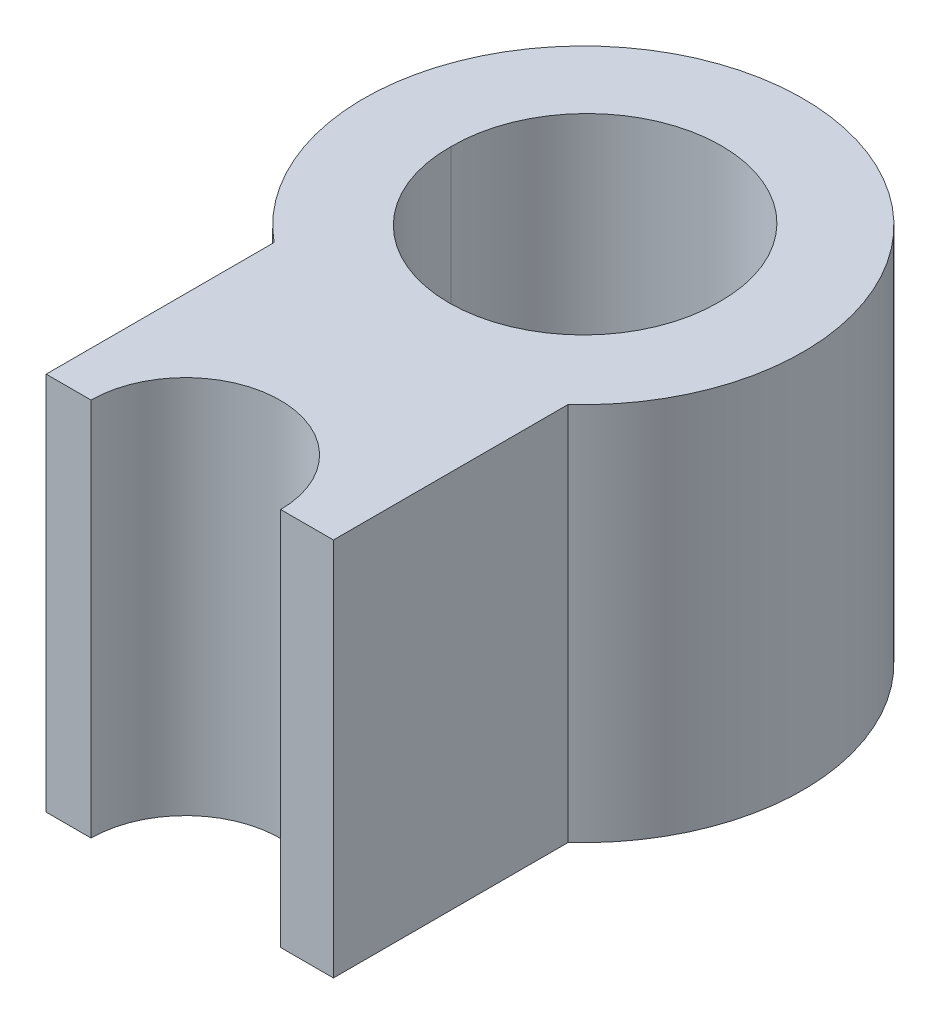
ISO-10303-21;
HEADER;
FILE_DESCRIPTION(('STEP AP214'),'2;1');
FILE_NAME('part.step','',(''),(''),'','','');
FILE_SCHEMA(('AUTOMOTIVE_DESIGN { 1 0 10303 214 1 1 1 1 }'));
ENDSEC;
DATA;
#1=APPLICATION_CONTEXT('core data for automotive mechanical design processes');
#2=APPLICATION_PROTOCOL_DEFINITION('international standard','automotive_design',2000,#1);
#3=PRODUCT_CONTEXT('',#1,'mechanical');
#4=PRODUCT('Part','Part','',(#3));
#5=PRODUCT_RELATED_PRODUCT_CATEGORY('part','',(#4));
#6=PRODUCT_DEFINITION_FORMATION('','',#4);
#7=PRODUCT_DEFINITION_CONTEXT('part definition',#1,'design');
#8=PRODUCT_DEFINITION('design','',#6,#7);
#9=PRODUCT_DEFINITION_SHAPE('','',#8);
#10=(LENGTH_UNIT() NAMED_UNIT(*) SI_UNIT(.MILLI.,.METRE.));
#11=(NAMED_UNIT(*) PLANE_ANGLE_UNIT() SI_UNIT($,.RADIAN.));
#12=(NAMED_UNIT(*) SI_UNIT($,.STERADIAN.) SOLID_ANGLE_UNIT());
#13=UNCERTAINTY_MEASURE_WITH_UNIT(LENGTH_MEASURE(1.E-05),#10,'distance_accuracy_value','');
#14=(GEOMETRIC_REPRESENTATION_CONTEXT(3) GLOBAL_UNCERTAINTY_ASSIGNED_CONTEXT((#13)) GLOBAL_UNIT_ASSIGNED_CONTEXT((#10,
#11,#12)) REPRESENTATION_CONTEXT('',''));
#15=CARTESIAN_POINT('',(0.,0.,0.));
#16=DIRECTION('',(0.,0.,1.));
#17=DIRECTION('',(1.,0.,0.));
#18=AXIS2_PLACEMENT_3D('',#15,#16,#17);
#19=CARTESIAN_POINT('',(1.26536763995187,2.87183105039429,15.59112871048));
#20=DIRECTION('',(0.,1.,0.));
#21=DIRECTION('',(0.,0.,-1.));
#22=AXIS2_PLACEMENT_3D('',#19,#20,#21);
#23=PLANE('',#22);
#24=CARTESIAN_POINT('',(-6.44353236004817,2.87183105039429,23.2098996244558));
#25=DIRECTION('',(0.,1.,0.));
#26=DIRECTION('',(0.,0.,-1.));
#27=AXIS2_PLACEMENT_3D('',#24,#25,#26);
#28=CIRCLE('',#27,0.425);
#29=CARTESIAN_POINT('',(-6.86849365773672,2.87183105039429,23.204164167467));
#30=VERTEX_POINT('',#29);
#31=CARTESIAN_POINT('',(-6.0185710623596,2.87183105039429,23.2041641674683));
#32=VERTEX_POINT('',#31);
#33=EDGE_CURVE('E117',#30,#32,#28,.T.);
#34=ORIENTED_EDGE('',*,*,#33,.F.);
#35=CARTESIAN_POINT('',(-6.44353236004815,2.87183105039429,23.1984287104753));
#36=DIRECTION('',(0.,1.,0.));
#37=DIRECTION('',(0.,0.,1.));
#38=AXIS2_PLACEMENT_3D('',#35,#36,#37);
#39=CIRCLE('',#38,0.425);
#40=EDGE_CURVE('E104',#32,#30,#39,.T.);
#41=ORIENTED_EDGE('',*,*,#40,.F.);
#42=EDGE_LOOP('',(#34,#41));
#43=FACE_BOUND('',#42,.T.);
#44=DIRECTION('',(-1.,0.,-1.06337566312106E-12));
#45=VECTOR('',#44,1.);
#46=CARTESIAN_POINT('',(-5.97671755616553,2.87183105039429,24.4671996244556));
#47=LINE('',#46,#45);
#48=CARTESIAN_POINT('',(-5.97671755616553,2.87183105039429,24.4671996244556));
#49=VERTEX_POINT('',#48);
#50=CARTESIAN_POINT('',(-6.14353487781278,2.87183105039429,24.4671996244555));
#51=VERTEX_POINT('',#50);
#52=EDGE_CURVE('E65',#49,#51,#47,.T.);
#53=ORIENTED_EDGE('',*,*,#52,.F.);
#54=DIRECTION('',(5.02522919053297E-13,0.,-1.));
#55=VECTOR('',#54,1.);
#56=CARTESIAN_POINT('',(-5.97671755616553,2.87183105039429,24.4671996244556));
#57=LINE('',#56,#55);
#58=CARTESIAN_POINT('',(-5.97671755616516,2.87183105039429,23.7245472516448));
#59=VERTEX_POINT('',#58);
#60=EDGE_CURVE('E54',#49,#59,#57,.T.);
#61=ORIENTED_EDGE('',*,*,#60,.T.);
#62=CARTESIAN_POINT('',(-6.44353236004817,2.87183105039429,23.2098996244558));
#63=DIRECTION('',(0.,1.,0.));
#64=DIRECTION('',(0.,0.,-1.));
#65=AXIS2_PLACEMENT_3D('',#62,#63,#64);
#66=CIRCLE('',#65,0.694822453073876);
#67=CARTESIAN_POINT('',(-6.88541144892764,2.87183105039429,23.7461095759735));
#68=VERTEX_POINT('',#67);
#69=EDGE_CURVE('E26',#59,#68,#66,.T.);
#70=ORIENTED_EDGE('',*,*,#69,.T.);
#71=DIRECTION('',(-5.6636748734305E-13,0.,-1.));
#72=VECTOR('',#71,1.);
#73=CARTESIAN_POINT('',(-6.88541144892723,2.87183105039429,24.467199624456));
#74=LINE('',#73,#72);
#75=CARTESIAN_POINT('',(-6.88541144892723,2.87183105039429,24.467199624456));
#76=VERTEX_POINT('',#75);
#77=EDGE_CURVE('E11',#76,#68,#74,.T.);
#78=ORIENTED_EDGE('',*,*,#77,.F.);
#79=DIRECTION('',(1.,0.,-1.62432664225037E-12));
#80=VECTOR('',#79,1.);
#81=CARTESIAN_POINT('',(-6.88541144892723,2.87183105039429,24.467199624456));
#82=LINE('',#81,#80);
#83=CARTESIAN_POINT('',(-6.74352984228348,2.87183105039429,24.4671996244558));
#84=VERTEX_POINT('',#83);
#85=EDGE_CURVE('E140',#76,#84,#82,.T.);
#86=ORIENTED_EDGE('',*,*,#85,.T.);
#87=CARTESIAN_POINT('',(-6.44353236004813,2.87183105039429,24.4684287104753));
#88=DIRECTION('',(0.,1.,0.));
#89=DIRECTION('',(0.999103542626609,0.,0.0423333333315546));
#90=AXIS2_PLACEMENT_3D('',#87,#88,#89);
#91=CIRCLE('',#90,0.299999999999991);
#92=EDGE_CURVE('E147',#51,#84,#91,.T.);
#93=ORIENTED_EDGE('',*,*,#92,.F.);
#94=EDGE_LOOP('',(#53,#61,#70,#78,#86,#93));
#95=FACE_BOUND('',#94,.T.);
#96=ADVANCED_FACE('F17',(#43,#95),#23,.T.);
#97=CARTESIAN_POINT('',(-6.88541144892723,2.87183105039429,24.467199624456));
#98=DIRECTION('',(-1.,0.,5.6636748734305E-13));
#99=DIRECTION('',(0.,1.,0.));
#100=AXIS2_PLACEMENT_3D('',#97,#98,#99);
#101=PLANE('',#100);
#102=DIRECTION('',(5.6636748734305E-13,0.,1.));
#103=VECTOR('',#102,1.);
#104=CARTESIAN_POINT('',(-6.88541144892974,1.6718310055699,20.0291641674703));
#105=LINE('',#104,#103);
#106=CARTESIAN_POINT('',(-6.88541144892763,1.6718310055699,23.7461095759735));
#107=VERTEX_POINT('',#106);
#108=CARTESIAN_POINT('',(-6.88541144892722,1.6718310055699,24.467199624456));
#109=VERTEX_POINT('',#108);
#110=EDGE_CURVE('E172',#107,#109,#105,.T.);
#111=ORIENTED_EDGE('',*,*,#110,.T.);
#112=DIRECTION('',(0.,-1.,0.));
#113=VECTOR('',#112,1.);
#114=CARTESIAN_POINT('',(-6.88541144892723,2.87183105039429,24.467199624456));
#115=LINE('',#114,#113);
#116=EDGE_CURVE('E141',#76,#109,#115,.T.);
#117=ORIENTED_EDGE('',*,*,#116,.F.);
#118=ORIENTED_EDGE('',*,*,#77,.T.);
#119=DIRECTION('',(0.,-1.,0.));
#120=VECTOR('',#119,1.);
#121=CARTESIAN_POINT('',(-6.88541144892764,2.87183105039429,23.7461095759735));
#122=LINE('',#121,#120);
#123=EDGE_CURVE('E157',#68,#107,#122,.T.);
#124=ORIENTED_EDGE('',*,*,#123,.T.);
#125=EDGE_LOOP('',(#111,#117,#118,#124));
#126=FACE_BOUND('',#125,.T.);
#127=ADVANCED_FACE('F171',(#126),#101,.T.);
#128=CARTESIAN_POINT('',(-6.44353236004817,2.87183105039429,23.2098996244558));
#129=DIRECTION('',(0.,-1.,0.));
#130=DIRECTION('',(0.,0.,-1.));
#131=AXIS2_PLACEMENT_3D('',#128,#129,#130);
#132=CYLINDRICAL_SURFACE('',#131,0.694822453073876);
#133=CARTESIAN_POINT('',(-6.44353236004817,1.6718310055699,23.2098996244558));
#134=DIRECTION('',(0.,1.,0.));
#135=DIRECTION('',(0.,0.,-1.));
#136=AXIS2_PLACEMENT_3D('',#133,#134,#135);
#137=CIRCLE('',#136,0.694822453073876);
#138=CARTESIAN_POINT('',(-5.97671755616515,1.6718310055699,23.7245472516448));
#139=VERTEX_POINT('',#138);
#140=EDGE_CURVE('E168',#139,#107,#137,.T.);
#141=ORIENTED_EDGE('',*,*,#140,.T.);
#142=ORIENTED_EDGE('',*,*,#123,.F.);
#143=ORIENTED_EDGE('',*,*,#69,.F.);
#144=DIRECTION('',(0.,-1.,0.));
#145=VECTOR('',#144,1.);
#146=CARTESIAN_POINT('',(-5.97671755616516,2.87183105039429,23.7245472516448));
#147=LINE('',#146,#145);
#148=EDGE_CURVE('E115',#59,#139,#147,.T.);
#149=ORIENTED_EDGE('',*,*,#148,.T.);
#150=EDGE_LOOP('',(#141,#142,#143,#149));
#151=FACE_BOUND('',#150,.T.);
#152=ADVANCED_FACE('F166',(#151),#132,.T.);
#153=CARTESIAN_POINT('',(-5.97671755616516,2.87183105039429,23.7245472516448));
#154=DIRECTION('',(1.,0.,5.02522919053297E-13));
#155=DIRECTION('',(-5.02522919053297E-13,0.,1.));
#156=AXIS2_PLACEMENT_3D('',#153,#154,#155);
#157=PLANE('',#156);
#158=DIRECTION('',(5.02522919053297E-13,0.,-1.));
#159=VECTOR('',#158,1.);
#160=CARTESIAN_POINT('',(-5.97671755616311,1.6718310055699,19.6578379810606));
#161=LINE('',#160,#159);
#162=CARTESIAN_POINT('',(-5.97671755616552,1.6718310055699,24.4671996244556));
#163=VERTEX_POINT('',#162);
#164=EDGE_CURVE('E198',#163,#139,#161,.T.);
#165=ORIENTED_EDGE('',*,*,#164,.T.);
#166=ORIENTED_EDGE('',*,*,#148,.F.);
#167=ORIENTED_EDGE('',*,*,#60,.F.);
#168=DIRECTION('',(0.,-1.,0.));
#169=VECTOR('',#168,1.);
#170=CARTESIAN_POINT('',(-5.97671755616553,2.87183105039429,24.4671996244556));
#171=LINE('',#170,#169);
#172=EDGE_CURVE('E148',#49,#163,#171,.T.);
#173=ORIENTED_EDGE('',*,*,#172,.T.);
#174=EDGE_LOOP('',(#165,#166,#167,#173));
#175=FACE_BOUND('',#174,.T.);
#176=ADVANCED_FACE('F227',(#175),#157,.T.);
#177=CARTESIAN_POINT('',(-6.44353236004815,2.87183105039429,23.1984287104753));
#178=DIRECTION('',(0.,-1.,0.));
#179=DIRECTION('',(1.56729040148588E-12,0.,-1.));
#180=AXIS2_PLACEMENT_3D('',#177,#178,#179);
#181=CYLINDRICAL_SURFACE('',#180,0.425);
#182=CARTESIAN_POINT('',(-6.44353236004815,1.6718310055699,23.1984287104753));
#183=DIRECTION('',(0.,-1.,0.));
#184=DIRECTION('',(0.,0.,1.));
#185=AXIS2_PLACEMENT_3D('',#182,#183,#184);
#186=CIRCLE('',#185,0.425);
#187=CARTESIAN_POINT('',(-6.86849365773671,1.6718310055699,23.204164167467));
#188=VERTEX_POINT('',#187);
#189=CARTESIAN_POINT('',(-6.01857106235959,1.6718310055699,23.2041641674683));
#190=VERTEX_POINT('',#189);
#191=EDGE_CURVE('E127',#188,#190,#186,.T.);
#192=ORIENTED_EDGE('',*,*,#191,.T.);
#193=DIRECTION('',(0.,-1.,0.));
#194=VECTOR('',#193,1.);
#195=CARTESIAN_POINT('',(-6.0185710623596,2.87183105039429,23.2041641674683));
#196=LINE('',#195,#194);
#197=EDGE_CURVE('E111',#32,#190,#196,.T.);
#198=ORIENTED_EDGE('',*,*,#197,.F.);
#199=ORIENTED_EDGE('',*,*,#40,.T.);
#200=DIRECTION('',(0.,-1.,0.));
#201=VECTOR('',#200,1.);
#202=CARTESIAN_POINT('',(-6.86849365773672,2.87183105039429,23.204164167467));
#203=LINE('',#202,#201);
#204=EDGE_CURVE('E109',#30,#188,#203,.T.);
#205=ORIENTED_EDGE('',*,*,#204,.T.);
#206=EDGE_LOOP('',(#192,#198,#199,#205));
#207=FACE_BOUND('',#206,.T.);
#208=ADVANCED_FACE('F107',(#207),#181,.F.);
#209=CARTESIAN_POINT('',(-5.97671755616553,2.87183105039429,24.4671996244556));
#210=DIRECTION('',(-1.06337566312106E-12,0.,1.));
#211=DIRECTION('',(1.,0.,1.06337566312106E-12));
#212=AXIS2_PLACEMENT_3D('',#209,#210,#211);
#213=PLANE('',#212);
#214=DIRECTION('',(1.,0.,1.06337566312106E-12));
#215=VECTOR('',#214,1.);
#216=CARTESIAN_POINT('',(-2.35567495811155,1.6718310055699,24.4671996244595));
#217=LINE('',#216,#215);
#218=CARTESIAN_POINT('',(-6.14353487781278,1.6718310055699,24.4671996244555));
#219=VERTEX_POINT('',#218);
#220=EDGE_CURVE('E192',#219,#163,#217,.T.);
#221=ORIENTED_EDGE('',*,*,#220,.T.);
#222=ORIENTED_EDGE('',*,*,#172,.F.);
#223=ORIENTED_EDGE('',*,*,#52,.T.);
#224=DIRECTION('',(0.,-1.,0.));
#225=VECTOR('',#224,1.);
#226=CARTESIAN_POINT('',(-6.14353487781278,2.87183105039429,24.4671996244555));
#227=LINE('',#226,#225);
#228=EDGE_CURVE('E144',#51,#219,#227,.T.);
#229=ORIENTED_EDGE('',*,*,#228,.T.);
#230=EDGE_LOOP('',(#221,#222,#223,#229));
#231=FACE_BOUND('',#230,.T.);
#232=ADVANCED_FACE('F218',(#231),#213,.T.);
#233=CARTESIAN_POINT('',(-6.44353236004813,2.87183105039429,24.4684287104753));
#234=DIRECTION('',(0.,-1.,0.));
#235=DIRECTION('',(-5.62679243476544E-13,0.,-1.));
#236=AXIS2_PLACEMENT_3D('',#233,#234,#235);
#237=CYLINDRICAL_SURFACE('',#236,0.299999999999991);
#238=CARTESIAN_POINT('',(-6.44353236004813,1.6718310055699,24.4684287104753));
#239=DIRECTION('',(0.,-1.,0.));
#240=DIRECTION('',(0.999103542626609,0.,0.0423333333315546));
#241=AXIS2_PLACEMENT_3D('',#238,#239,#240);
#242=CIRCLE('',#241,0.299999999999991);
#243=CARTESIAN_POINT('',(-6.74352984228347,1.6718310055699,24.4671996244558));
#244=VERTEX_POINT('',#243);
#245=EDGE_CURVE('E184',#244,#219,#242,.T.);
#246=ORIENTED_EDGE('',*,*,#245,.T.);
#247=ORIENTED_EDGE('',*,*,#228,.F.);
#248=ORIENTED_EDGE('',*,*,#92,.T.);
#249=DIRECTION('',(0.,-1.,0.));
#250=VECTOR('',#249,1.);
#251=CARTESIAN_POINT('',(-6.74352984228348,2.87183105039429,24.4671996244558));
#252=LINE('',#251,#250);
#253=EDGE_CURVE('E137',#84,#244,#252,.T.);
#254=ORIENTED_EDGE('',*,*,#253,.T.);
#255=EDGE_LOOP('',(#246,#247,#248,#254));
#256=FACE_BOUND('',#255,.T.);
#257=ADVANCED_FACE('F207',(#256),#237,.F.);
#258=CARTESIAN_POINT('',(-6.74352984228348,2.87183105039429,24.4671996244558));
#259=DIRECTION('',(1.62432664225037E-12,0.,1.));
#260=DIRECTION('',(1.,0.,-1.62432664225037E-12));
#261=AXIS2_PLACEMENT_3D('',#258,#259,#260);
#262=PLANE('',#261);
#263=DIRECTION('',(1.,0.,-1.62432664225037E-12));
#264=VECTOR('',#263,1.);
#265=CARTESIAN_POINT('',(-2.73908110115859,1.6718310055699,24.4671996244493));
#266=LINE('',#265,#264);
#267=EDGE_CURVE('E177',#109,#244,#266,.T.);
#268=ORIENTED_EDGE('',*,*,#267,.T.);
#269=ORIENTED_EDGE('',*,*,#253,.F.);
#270=ORIENTED_EDGE('',*,*,#85,.F.);
#271=ORIENTED_EDGE('',*,*,#116,.T.);
#272=EDGE_LOOP('',(#268,#269,#270,#271));
#273=FACE_BOUND('',#272,.T.);
#274=ADVANCED_FACE('F209',(#273),#262,.T.);
#275=CARTESIAN_POINT('',(-6.44353236004817,2.87183105039429,23.2098996244558));
#276=DIRECTION('',(0.,-1.,0.));
#277=DIRECTION('',(-1.56729040148588E-12,0.,1.));
#278=AXIS2_PLACEMENT_3D('',#275,#276,#277);
#279=CYLINDRICAL_SURFACE('',#278,0.425);
#280=CARTESIAN_POINT('',(-6.44353236004817,1.6718310055699,23.2098996244558));
#281=DIRECTION('',(0.,-1.,0.));
#282=DIRECTION('',(0.,0.,-1.));
#283=AXIS2_PLACEMENT_3D('',#280,#281,#282);
#284=CIRCLE('',#283,0.425);
#285=EDGE_CURVE('E125',#190,#188,#284,.T.);
#286=ORIENTED_EDGE('',*,*,#285,.T.);
#287=ORIENTED_EDGE('',*,*,#204,.F.);
#288=ORIENTED_EDGE('',*,*,#33,.T.);
#289=ORIENTED_EDGE('',*,*,#197,.T.);
#290=EDGE_LOOP('',(#286,#287,#288,#289));
#291=FACE_BOUND('',#290,.T.);
#292=ADVANCED_FACE('F123',(#291),#279,.F.);
#293=CARTESIAN_POINT('',(1.26536763995188,1.6718310055699,15.59112871048));
#294=DIRECTION('',(0.,1.,0.));
#295=DIRECTION('',(0.,0.,-1.));
#296=AXIS2_PLACEMENT_3D('',#293,#294,#295);
#297=PLANE('',#296);
#298=ORIENTED_EDGE('',*,*,#285,.F.);
#299=ORIENTED_EDGE('',*,*,#191,.F.);
#300=EDGE_LOOP('',(#298,#299));
#301=FACE_BOUND('',#300,.T.);
#302=ORIENTED_EDGE('',*,*,#220,.F.);
#303=ORIENTED_EDGE('',*,*,#245,.F.);
#304=ORIENTED_EDGE('',*,*,#267,.F.);
#305=ORIENTED_EDGE('',*,*,#110,.F.);
#306=ORIENTED_EDGE('',*,*,#140,.F.);
#307=ORIENTED_EDGE('',*,*,#164,.F.);
#308=EDGE_LOOP('',(#302,#303,#304,#305,#306,#307));
#309=FACE_BOUND('',#308,.T.);
#310=ADVANCED_FACE('F182',(#301,#309),#297,.F.);
#311=CLOSED_SHELL('',(#96,#127,#152,#176,#208,#232,#257,#274,#292,#310));
#312=MANIFOLD_SOLID_BREP('B1',#311);
#313=ADVANCED_BREP_SHAPE_REPRESENTATION('',(#18,#312),#14);
#314=SHAPE_DEFINITION_REPRESENTATION(#9,#313);
ENDSEC;
END-ISO-10303-21;
